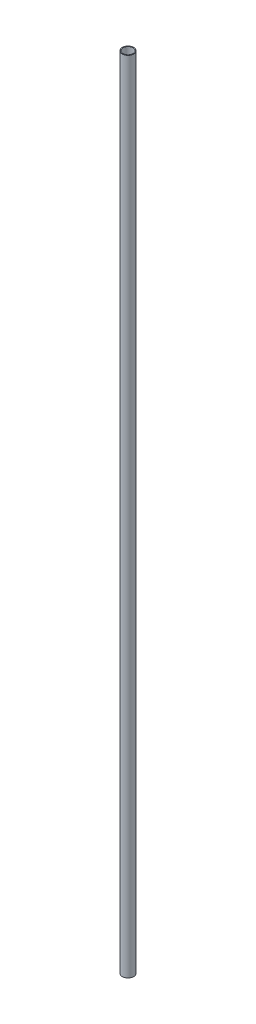
ISO-10303-21;
HEADER;
FILE_DESCRIPTION(('STEP AP214'),'2;1');
FILE_NAME('part.step','',(''),(''),'','','');
FILE_SCHEMA(('AUTOMOTIVE_DESIGN { 1 0 10303 214 1 1 1 1 }'));
ENDSEC;
DATA;
#1=APPLICATION_CONTEXT('core data for automotive mechanical design processes');
#2=APPLICATION_PROTOCOL_DEFINITION('international standard','automotive_design',2000,#1);
#3=PRODUCT_CONTEXT('',#1,'mechanical');
#4=PRODUCT('Part','Part','',(#3));
#5=PRODUCT_RELATED_PRODUCT_CATEGORY('part','',(#4));
#6=PRODUCT_DEFINITION_FORMATION('','',#4);
#7=PRODUCT_DEFINITION_CONTEXT('part definition',#1,'design');
#8=PRODUCT_DEFINITION('design','',#6,#7);
#9=PRODUCT_DEFINITION_SHAPE('','',#8);
#10=(LENGTH_UNIT() NAMED_UNIT(*) SI_UNIT(.MILLI.,.METRE.));
#11=(NAMED_UNIT(*) PLANE_ANGLE_UNIT() SI_UNIT($,.RADIAN.));
#12=(NAMED_UNIT(*) SI_UNIT($,.STERADIAN.) SOLID_ANGLE_UNIT());
#13=UNCERTAINTY_MEASURE_WITH_UNIT(LENGTH_MEASURE(1.E-05),#10,'distance_accuracy_value','');
#14=(GEOMETRIC_REPRESENTATION_CONTEXT(3) GLOBAL_UNCERTAINTY_ASSIGNED_CONTEXT((#13)) GLOBAL_UNIT_ASSIGNED_CONTEXT((#10,
#11,#12)) REPRESENTATION_CONTEXT('',''));
#15=CARTESIAN_POINT('',(0.,0.,0.));
#16=DIRECTION('',(0.,0.,1.));
#17=DIRECTION('',(1.,0.,0.));
#18=AXIS2_PLACEMENT_3D('',#15,#16,#17);
#19=CARTESIAN_POINT('',(0.,1320.8,0.));
#20=DIRECTION('',(0.,1.,0.));
#21=DIRECTION('',(0.,0.,1.));
#22=AXIS2_PLACEMENT_3D('',#19,#20,#21);
#23=PLANE('',#22);
#24=CARTESIAN_POINT('',(0.,1320.8,0.));
#25=DIRECTION('',(0.,1.,0.));
#26=DIRECTION('',(0.,0.,1.));
#27=AXIS2_PLACEMENT_3D('',#24,#25,#26);
#28=CIRCLE('',#27,9.525);
#29=CARTESIAN_POINT('',(0.,1320.8,9.525));
#30=VERTEX_POINT('',#29);
#31=EDGE_CURVE('E10',#30,#30,#28,.T.);
#32=ORIENTED_EDGE('',*,*,#31,.T.);
#33=EDGE_LOOP('',(#32));
#34=FACE_BOUND('',#33,.T.);
#35=CARTESIAN_POINT('',(0.,1320.8,0.));
#36=DIRECTION('',(0.,1.,0.));
#37=DIRECTION('',(0.,0.,1.));
#38=AXIS2_PLACEMENT_3D('',#35,#36,#37);
#39=CIRCLE('',#38,8.2804);
#40=CARTESIAN_POINT('',(0.,1320.8,8.2804));
#41=VERTEX_POINT('',#40);
#42=EDGE_CURVE('E50',#41,#41,#39,.T.);
#43=ORIENTED_EDGE('',*,*,#42,.F.);
#44=EDGE_LOOP('',(#43));
#45=FACE_BOUND('',#44,.T.);
#46=ADVANCED_FACE('F39',(#34,#45),#23,.T.);
#47=CARTESIAN_POINT('',(0.,0.,0.));
#48=DIRECTION('',(0.,1.,0.));
#49=DIRECTION('',(0.,0.,1.));
#50=AXIS2_PLACEMENT_3D('',#47,#48,#49);
#51=PLANE('',#50);
#52=CARTESIAN_POINT('',(0.,0.,0.));
#53=DIRECTION('',(0.,1.,0.));
#54=DIRECTION('',(0.,0.,1.));
#55=AXIS2_PLACEMENT_3D('',#52,#53,#54);
#56=CIRCLE('',#55,9.525);
#57=CARTESIAN_POINT('',(0.,0.,9.525));
#58=VERTEX_POINT('',#57);
#59=EDGE_CURVE('E43',#58,#58,#56,.T.);
#60=ORIENTED_EDGE('',*,*,#59,.F.);
#61=EDGE_LOOP('',(#60));
#62=FACE_BOUND('',#61,.T.);
#63=CARTESIAN_POINT('',(0.,0.,0.));
#64=DIRECTION('',(0.,1.,0.));
#65=DIRECTION('',(0.,0.,1.));
#66=AXIS2_PLACEMENT_3D('',#63,#64,#65);
#67=CIRCLE('',#66,8.2804);
#68=CARTESIAN_POINT('',(0.,0.,8.2804));
#69=VERTEX_POINT('',#68);
#70=EDGE_CURVE('E52',#69,#69,#67,.T.);
#71=ORIENTED_EDGE('',*,*,#70,.T.);
#72=EDGE_LOOP('',(#71));
#73=FACE_BOUND('',#72,.T.);
#74=ADVANCED_FACE('F62',(#62,#73),#51,.F.);
#75=CARTESIAN_POINT('',(0.,1320.8,0.));
#76=DIRECTION('',(0.,-1.,0.));
#77=DIRECTION('',(0.,0.,-1.));
#78=AXIS2_PLACEMENT_3D('',#75,#76,#77);
#79=CYLINDRICAL_SURFACE('',#78,9.525);
#80=ORIENTED_EDGE('',*,*,#31,.F.);
#81=EDGE_LOOP('',(#80));
#82=FACE_BOUND('',#81,.T.);
#83=ORIENTED_EDGE('',*,*,#59,.T.);
#84=EDGE_LOOP('',(#83));
#85=FACE_BOUND('',#84,.T.);
#86=ADVANCED_FACE('F41',(#82,#85),#79,.T.);
#87=CARTESIAN_POINT('',(0.,1320.8,0.));
#88=DIRECTION('',(0.,-1.,0.));
#89=DIRECTION('',(0.,0.,-1.));
#90=AXIS2_PLACEMENT_3D('',#87,#88,#89);
#91=CYLINDRICAL_SURFACE('',#90,8.2804);
#92=ORIENTED_EDGE('',*,*,#42,.T.);
#93=EDGE_LOOP('',(#92));
#94=FACE_BOUND('',#93,.T.);
#95=ORIENTED_EDGE('',*,*,#70,.F.);
#96=EDGE_LOOP('',(#95));
#97=FACE_BOUND('',#96,.T.);
#98=ADVANCED_FACE('F58',(#94,#97),#91,.F.);
#99=CLOSED_SHELL('',(#46,#74,#86,#98));
#100=MANIFOLD_SOLID_BREP('B2',#99);
#101=ADVANCED_BREP_SHAPE_REPRESENTATION('',(#18,#100),#14);
#102=SHAPE_DEFINITION_REPRESENTATION(#9,#101);
ENDSEC;
END-ISO-10303-21;
